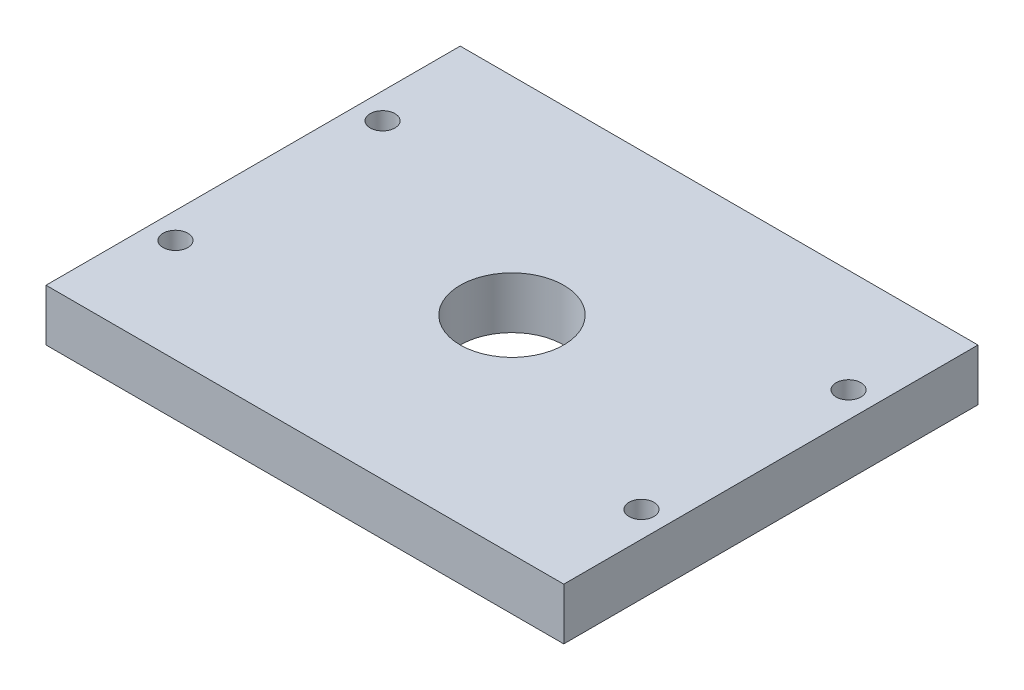
ISO-10303-21;
HEADER;
FILE_DESCRIPTION(('STEP AP214'),'2;1');
FILE_NAME('part.step','',(''),(''),'','','');
FILE_SCHEMA(('AUTOMOTIVE_DESIGN { 1 0 10303 214 1 1 1 1 }'));
ENDSEC;
DATA;
#1=APPLICATION_CONTEXT('core data for automotive mechanical design processes');
#2=APPLICATION_PROTOCOL_DEFINITION('international standard','automotive_design',2000,#1);
#3=PRODUCT_CONTEXT('',#1,'mechanical');
#4=PRODUCT('Part','Part','',(#3));
#5=PRODUCT_RELATED_PRODUCT_CATEGORY('part','',(#4));
#6=PRODUCT_DEFINITION_FORMATION('','',#4);
#7=PRODUCT_DEFINITION_CONTEXT('part definition',#1,'design');
#8=PRODUCT_DEFINITION('design','',#6,#7);
#9=PRODUCT_DEFINITION_SHAPE('','',#8);
#10=(LENGTH_UNIT() NAMED_UNIT(*) SI_UNIT(.MILLI.,.METRE.));
#11=(NAMED_UNIT(*) PLANE_ANGLE_UNIT() SI_UNIT($,.RADIAN.));
#12=(NAMED_UNIT(*) SI_UNIT($,.STERADIAN.) SOLID_ANGLE_UNIT());
#13=UNCERTAINTY_MEASURE_WITH_UNIT(LENGTH_MEASURE(1.E-05),#10,'distance_accuracy_value','');
#14=(GEOMETRIC_REPRESENTATION_CONTEXT(3) GLOBAL_UNCERTAINTY_ASSIGNED_CONTEXT((#13)) GLOBAL_UNIT_ASSIGNED_CONTEXT((#10,
#11,#12)) REPRESENTATION_CONTEXT('',''));
#15=CARTESIAN_POINT('',(0.,0.,0.));
#16=DIRECTION('',(0.,0.,1.));
#17=DIRECTION('',(1.,0.,0.));
#18=AXIS2_PLACEMENT_3D('',#15,#16,#17);
#19=CARTESIAN_POINT('',(0.,5.,0.));
#20=DIRECTION('',(0.,-1.,0.));
#21=DIRECTION('',(0.,0.,-1.));
#22=AXIS2_PLACEMENT_3D('',#19,#20,#21);
#23=PLANE('',#22);
#24=CARTESIAN_POINT('',(-22.5,5.,10.));
#25=DIRECTION('',(0.,-1.,0.));
#26=DIRECTION('',(0.,0.,-1.));
#27=AXIS2_PLACEMENT_3D('',#24,#25,#26);
#28=CIRCLE('',#27,1.2);
#29=CARTESIAN_POINT('',(-22.5,5.,8.8));
#30=VERTEX_POINT('',#29);
#31=EDGE_CURVE('E149',#30,#30,#28,.T.);
#32=ORIENTED_EDGE('',*,*,#31,.T.);
#33=EDGE_LOOP('',(#32));
#34=FACE_BOUND('',#33,.T.);
#35=CARTESIAN_POINT('',(-22.5,5.,-9.99999999999999));
#36=DIRECTION('',(0.,-1.,0.));
#37=DIRECTION('',(0.,0.,-1.));
#38=AXIS2_PLACEMENT_3D('',#35,#36,#37);
#39=CIRCLE('',#38,1.2);
#40=CARTESIAN_POINT('',(-22.5,5.,-11.2));
#41=VERTEX_POINT('',#40);
#42=EDGE_CURVE('E140',#41,#41,#39,.T.);
#43=ORIENTED_EDGE('',*,*,#42,.T.);
#44=EDGE_LOOP('',(#43));
#45=FACE_BOUND('',#44,.T.);
#46=CARTESIAN_POINT('',(22.5,5.,-9.99999999999999));
#47=DIRECTION('',(0.,-1.,0.));
#48=DIRECTION('',(0.,0.,-1.));
#49=AXIS2_PLACEMENT_3D('',#46,#47,#48);
#50=CIRCLE('',#49,1.2);
#51=CARTESIAN_POINT('',(22.5,5.,-11.2));
#52=VERTEX_POINT('',#51);
#53=EDGE_CURVE('E131',#52,#52,#50,.T.);
#54=ORIENTED_EDGE('',*,*,#53,.T.);
#55=EDGE_LOOP('',(#54));
#56=FACE_BOUND('',#55,.T.);
#57=CARTESIAN_POINT('',(22.5,5.,10.));
#58=DIRECTION('',(0.,-1.,0.));
#59=DIRECTION('',(0.,0.,-1.));
#60=AXIS2_PLACEMENT_3D('',#57,#58,#59);
#61=CIRCLE('',#60,1.2);
#62=CARTESIAN_POINT('',(22.5,5.,8.8));
#63=VERTEX_POINT('',#62);
#64=EDGE_CURVE('E120',#63,#63,#61,.T.);
#65=ORIENTED_EDGE('',*,*,#64,.T.);
#66=EDGE_LOOP('',(#65));
#67=FACE_BOUND('',#66,.T.);
#68=DIRECTION('',(0.,0.,-1.));
#69=VECTOR('',#68,1.);
#70=CARTESIAN_POINT('',(25.,5.,20.));
#71=LINE('',#70,#69);
#72=CARTESIAN_POINT('',(25.,5.,20.));
#73=VERTEX_POINT('',#72);
#74=CARTESIAN_POINT('',(25.,5.,-20.));
#75=VERTEX_POINT('',#74);
#76=EDGE_CURVE('E90',#73,#75,#71,.T.);
#77=ORIENTED_EDGE('',*,*,#76,.T.);
#78=DIRECTION('',(-1.,0.,0.));
#79=VECTOR('',#78,1.);
#80=CARTESIAN_POINT('',(-25.,5.,-20.));
#81=LINE('',#80,#79);
#82=CARTESIAN_POINT('',(-25.,5.,-20.));
#83=VERTEX_POINT('',#82);
#84=EDGE_CURVE('E85',#75,#83,#81,.T.);
#85=ORIENTED_EDGE('',*,*,#84,.T.);
#86=DIRECTION('',(0.,0.,1.));
#87=VECTOR('',#86,1.);
#88=CARTESIAN_POINT('',(-25.,5.,20.));
#89=LINE('',#88,#87);
#90=CARTESIAN_POINT('',(-25.,5.,20.));
#91=VERTEX_POINT('',#90);
#92=EDGE_CURVE('E88',#83,#91,#89,.T.);
#93=ORIENTED_EDGE('',*,*,#92,.T.);
#94=DIRECTION('',(1.,0.,0.));
#95=VECTOR('',#94,1.);
#96=CARTESIAN_POINT('',(-25.,5.,20.));
#97=LINE('',#96,#95);
#98=EDGE_CURVE('E55',#91,#73,#97,.T.);
#99=ORIENTED_EDGE('',*,*,#98,.T.);
#100=EDGE_LOOP('',(#77,#85,#93,#99));
#101=FACE_BOUND('',#100,.T.);
#102=CARTESIAN_POINT('',(0.,5.,0.));
#103=DIRECTION('',(0.,1.,0.));
#104=DIRECTION('',(0.,0.,1.));
#105=AXIS2_PLACEMENT_3D('',#102,#103,#104);
#106=CIRCLE('',#105,5.);
#107=CARTESIAN_POINT('',(0.,5.,5.00000000000001));
#108=VERTEX_POINT('',#107);
#109=EDGE_CURVE('E105',#108,#108,#106,.T.);
#110=ORIENTED_EDGE('',*,*,#109,.F.);
#111=EDGE_LOOP('',(#110));
#112=FACE_BOUND('',#111,.T.);
#113=ADVANCED_FACE('F38',(#34,#45,#56,#67,#101,#112),#23,.F.);
#114=CARTESIAN_POINT('',(0.,0.,0.));
#115=DIRECTION('',(0.,-1.,0.));
#116=DIRECTION('',(0.,0.,-1.));
#117=AXIS2_PLACEMENT_3D('',#114,#115,#116);
#118=PLANE('',#117);
#119=CARTESIAN_POINT('',(-22.5,0.,10.));
#120=DIRECTION('',(0.,-1.,0.));
#121=DIRECTION('',(0.,0.,-1.));
#122=AXIS2_PLACEMENT_3D('',#119,#120,#121);
#123=CIRCLE('',#122,2.2);
#124=CARTESIAN_POINT('',(-22.5,0.,7.8));
#125=VERTEX_POINT('',#124);
#126=EDGE_CURVE('E155',#125,#125,#123,.T.);
#127=ORIENTED_EDGE('',*,*,#126,.F.);
#128=EDGE_LOOP('',(#127));
#129=FACE_BOUND('',#128,.T.);
#130=CARTESIAN_POINT('',(-22.5,0.,-9.99999999999999));
#131=DIRECTION('',(0.,-1.,0.));
#132=DIRECTION('',(0.,0.,-1.));
#133=AXIS2_PLACEMENT_3D('',#130,#131,#132);
#134=CIRCLE('',#133,2.2);
#135=CARTESIAN_POINT('',(-22.5,0.,-12.2));
#136=VERTEX_POINT('',#135);
#137=EDGE_CURVE('E146',#136,#136,#134,.T.);
#138=ORIENTED_EDGE('',*,*,#137,.F.);
#139=EDGE_LOOP('',(#138));
#140=FACE_BOUND('',#139,.T.);
#141=CARTESIAN_POINT('',(22.5,0.,-9.99999999999999));
#142=DIRECTION('',(0.,-1.,0.));
#143=DIRECTION('',(0.,0.,-1.));
#144=AXIS2_PLACEMENT_3D('',#141,#142,#143);
#145=CIRCLE('',#144,2.2);
#146=CARTESIAN_POINT('',(22.5,0.,-12.2));
#147=VERTEX_POINT('',#146);
#148=EDGE_CURVE('E137',#147,#147,#145,.T.);
#149=ORIENTED_EDGE('',*,*,#148,.F.);
#150=EDGE_LOOP('',(#149));
#151=FACE_BOUND('',#150,.T.);
#152=CARTESIAN_POINT('',(22.5,0.,10.));
#153=DIRECTION('',(0.,-1.,0.));
#154=DIRECTION('',(0.,0.,-1.));
#155=AXIS2_PLACEMENT_3D('',#152,#153,#154);
#156=CIRCLE('',#155,2.2);
#157=CARTESIAN_POINT('',(22.5,0.,7.8));
#158=VERTEX_POINT('',#157);
#159=EDGE_CURVE('E128',#158,#158,#156,.T.);
#160=ORIENTED_EDGE('',*,*,#159,.F.);
#161=EDGE_LOOP('',(#160));
#162=FACE_BOUND('',#161,.T.);
#163=DIRECTION('',(0.,0.,-1.));
#164=VECTOR('',#163,1.);
#165=CARTESIAN_POINT('',(25.,0.,20.));
#166=LINE('',#165,#164);
#167=CARTESIAN_POINT('',(25.,0.,20.));
#168=VERTEX_POINT('',#167);
#169=CARTESIAN_POINT('',(25.,0.,-20.));
#170=VERTEX_POINT('',#169);
#171=EDGE_CURVE('E102',#168,#170,#166,.T.);
#172=ORIENTED_EDGE('',*,*,#171,.F.);
#173=DIRECTION('',(1.,0.,0.));
#174=VECTOR('',#173,1.);
#175=CARTESIAN_POINT('',(-25.,0.,20.));
#176=LINE('',#175,#174);
#177=CARTESIAN_POINT('',(-25.,0.,20.));
#178=VERTEX_POINT('',#177);
#179=EDGE_CURVE('E78',#178,#168,#176,.T.);
#180=ORIENTED_EDGE('',*,*,#179,.F.);
#181=DIRECTION('',(0.,0.,1.));
#182=VECTOR('',#181,1.);
#183=CARTESIAN_POINT('',(-25.,0.,20.));
#184=LINE('',#183,#182);
#185=CARTESIAN_POINT('',(-25.,0.,-20.));
#186=VERTEX_POINT('',#185);
#187=EDGE_CURVE('E72',#186,#178,#184,.T.);
#188=ORIENTED_EDGE('',*,*,#187,.F.);
#189=DIRECTION('',(-1.,0.,0.));
#190=VECTOR('',#189,1.);
#191=CARTESIAN_POINT('',(-25.,0.,-20.));
#192=LINE('',#191,#190);
#193=EDGE_CURVE('E94',#170,#186,#192,.T.);
#194=ORIENTED_EDGE('',*,*,#193,.F.);
#195=EDGE_LOOP('',(#172,#180,#188,#194));
#196=FACE_BOUND('',#195,.T.);
#197=CARTESIAN_POINT('',(0.,0.,0.));
#198=DIRECTION('',(0.,1.,0.));
#199=DIRECTION('',(0.,0.,1.));
#200=AXIS2_PLACEMENT_3D('',#197,#198,#199);
#201=CIRCLE('',#200,5.);
#202=CARTESIAN_POINT('',(0.,0.,5.00000000000001));
#203=VERTEX_POINT('',#202);
#204=EDGE_CURVE('E117',#203,#203,#201,.T.);
#205=ORIENTED_EDGE('',*,*,#204,.T.);
#206=EDGE_LOOP('',(#205));
#207=FACE_BOUND('',#206,.T.);
#208=ADVANCED_FACE('F113',(#129,#140,#151,#162,#196,#207),#118,.T.);
#209=CARTESIAN_POINT('',(25.,5.,20.));
#210=DIRECTION('',(-1.,0.,0.));
#211=DIRECTION('',(0.,0.,1.));
#212=AXIS2_PLACEMENT_3D('',#209,#210,#211);
#213=PLANE('',#212);
#214=ORIENTED_EDGE('',*,*,#171,.T.);
#215=DIRECTION('',(0.,-1.,0.));
#216=VECTOR('',#215,1.);
#217=CARTESIAN_POINT('',(25.,5.,-20.));
#218=LINE('',#217,#216);
#219=EDGE_CURVE('E11',#75,#170,#218,.T.);
#220=ORIENTED_EDGE('',*,*,#219,.F.);
#221=ORIENTED_EDGE('',*,*,#76,.F.);
#222=DIRECTION('',(0.,-1.,0.));
#223=VECTOR('',#222,1.);
#224=CARTESIAN_POINT('',(25.,5.,20.));
#225=LINE('',#224,#223);
#226=EDGE_CURVE('E98',#73,#168,#225,.T.);
#227=ORIENTED_EDGE('',*,*,#226,.T.);
#228=EDGE_LOOP('',(#214,#220,#221,#227));
#229=FACE_BOUND('',#228,.T.);
#230=ADVANCED_FACE('F40',(#229),#213,.F.);
#231=CARTESIAN_POINT('',(-25.,5.,-20.));
#232=DIRECTION('',(0.,0.,1.));
#233=DIRECTION('',(1.,0.,0.));
#234=AXIS2_PLACEMENT_3D('',#231,#232,#233);
#235=PLANE('',#234);
#236=ORIENTED_EDGE('',*,*,#193,.T.);
#237=DIRECTION('',(0.,-1.,0.));
#238=VECTOR('',#237,1.);
#239=CARTESIAN_POINT('',(-25.,5.,-20.));
#240=LINE('',#239,#238);
#241=EDGE_CURVE('E47',#83,#186,#240,.T.);
#242=ORIENTED_EDGE('',*,*,#241,.F.);
#243=ORIENTED_EDGE('',*,*,#84,.F.);
#244=ORIENTED_EDGE('',*,*,#219,.T.);
#245=EDGE_LOOP('',(#236,#242,#243,#244));
#246=FACE_BOUND('',#245,.T.);
#247=ADVANCED_FACE('F93',(#246),#235,.F.);
#248=CARTESIAN_POINT('',(-25.,5.,20.));
#249=DIRECTION('',(1.,0.,0.));
#250=DIRECTION('',(0.,0.,-1.));
#251=AXIS2_PLACEMENT_3D('',#248,#249,#250);
#252=PLANE('',#251);
#253=ORIENTED_EDGE('',*,*,#187,.T.);
#254=DIRECTION('',(0.,-1.,0.));
#255=VECTOR('',#254,1.);
#256=CARTESIAN_POINT('',(-25.,5.,20.));
#257=LINE('',#256,#255);
#258=EDGE_CURVE('E95',#91,#178,#257,.T.);
#259=ORIENTED_EDGE('',*,*,#258,.F.);
#260=ORIENTED_EDGE('',*,*,#92,.F.);
#261=ORIENTED_EDGE('',*,*,#241,.T.);
#262=EDGE_LOOP('',(#253,#259,#260,#261));
#263=FACE_BOUND('',#262,.T.);
#264=ADVANCED_FACE('F96',(#263),#252,.F.);
#265=CARTESIAN_POINT('',(-25.,5.,20.));
#266=DIRECTION('',(0.,0.,-1.));
#267=DIRECTION('',(-1.,0.,0.));
#268=AXIS2_PLACEMENT_3D('',#265,#266,#267);
#269=PLANE('',#268);
#270=ORIENTED_EDGE('',*,*,#179,.T.);
#271=ORIENTED_EDGE('',*,*,#226,.F.);
#272=ORIENTED_EDGE('',*,*,#98,.F.);
#273=ORIENTED_EDGE('',*,*,#258,.T.);
#274=EDGE_LOOP('',(#270,#271,#272,#273));
#275=FACE_BOUND('',#274,.T.);
#276=ADVANCED_FACE('F110',(#275),#269,.F.);
#277=CARTESIAN_POINT('',(0.,5.,0.));
#278=DIRECTION('',(0.,-1.,0.));
#279=DIRECTION('',(0.,0.,-1.));
#280=AXIS2_PLACEMENT_3D('',#277,#278,#279);
#281=CYLINDRICAL_SURFACE('',#280,5.);
#282=ORIENTED_EDGE('',*,*,#109,.T.);
#283=EDGE_LOOP('',(#282));
#284=FACE_BOUND('',#283,.T.);
#285=ORIENTED_EDGE('',*,*,#204,.F.);
#286=EDGE_LOOP('',(#285));
#287=FACE_BOUND('',#286,.T.);
#288=ADVANCED_FACE('F183',(#284,#287),#281,.F.);
#289=CARTESIAN_POINT('',(22.5,0.,10.));
#290=DIRECTION('',(0.,-1.,0.));
#291=DIRECTION('',(0.,0.,-1.));
#292=AXIS2_PLACEMENT_3D('',#289,#290,#291);
#293=CYLINDRICAL_SURFACE('',#292,1.2);
#294=ORIENTED_EDGE('',*,*,#64,.F.);
#295=EDGE_LOOP('',(#294));
#296=FACE_BOUND('',#295,.T.);
#297=CARTESIAN_POINT('',(22.5,1.,10.));
#298=DIRECTION('',(0.,-1.,0.));
#299=DIRECTION('',(0.,0.,-1.));
#300=AXIS2_PLACEMENT_3D('',#297,#298,#299);
#301=CIRCLE('',#300,1.2);
#302=CARTESIAN_POINT('',(22.5,1.,8.8));
#303=VERTEX_POINT('',#302);
#304=EDGE_CURVE('E125',#303,#303,#301,.T.);
#305=ORIENTED_EDGE('',*,*,#304,.T.);
#306=EDGE_LOOP('',(#305));
#307=FACE_BOUND('',#306,.T.);
#308=ADVANCED_FACE('F173',(#296,#307),#293,.F.);
#309=CARTESIAN_POINT('',(22.5,0.,10.));
#310=DIRECTION('',(0.,-1.,0.));
#311=DIRECTION('',(0.,0.,-1.));
#312=AXIS2_PLACEMENT_3D('',#309,#310,#311);
#313=CONICAL_SURFACE('',#312,2.2,0.785398163397447);
#314=ORIENTED_EDGE('',*,*,#304,.F.);
#315=EDGE_LOOP('',(#314));
#316=FACE_BOUND('',#315,.T.);
#317=ORIENTED_EDGE('',*,*,#159,.T.);
#318=EDGE_LOOP('',(#317));
#319=FACE_BOUND('',#318,.T.);
#320=ADVANCED_FACE('F170',(#316,#319),#313,.F.);
#321=CARTESIAN_POINT('',(22.5,0.,-9.99999999999999));
#322=DIRECTION('',(0.,-1.,0.));
#323=DIRECTION('',(0.,0.,-1.));
#324=AXIS2_PLACEMENT_3D('',#321,#322,#323);
#325=CYLINDRICAL_SURFACE('',#324,1.2);
#326=ORIENTED_EDGE('',*,*,#53,.F.);
#327=EDGE_LOOP('',(#326));
#328=FACE_BOUND('',#327,.T.);
#329=CARTESIAN_POINT('',(22.5,1.,-9.99999999999999));
#330=DIRECTION('',(0.,-1.,0.));
#331=DIRECTION('',(0.,0.,-1.));
#332=AXIS2_PLACEMENT_3D('',#329,#330,#331);
#333=CIRCLE('',#332,1.2);
#334=CARTESIAN_POINT('',(22.5,1.,-11.2));
#335=VERTEX_POINT('',#334);
#336=EDGE_CURVE('E134',#335,#335,#333,.T.);
#337=ORIENTED_EDGE('',*,*,#336,.T.);
#338=EDGE_LOOP('',(#337));
#339=FACE_BOUND('',#338,.T.);
#340=ADVANCED_FACE('F172',(#328,#339),#325,.F.);
#341=CARTESIAN_POINT('',(22.5,0.,-9.99999999999999));
#342=DIRECTION('',(0.,-1.,0.));
#343=DIRECTION('',(0.,0.,-1.));
#344=AXIS2_PLACEMENT_3D('',#341,#342,#343);
#345=CONICAL_SURFACE('',#344,2.2,0.785398163397447);
#346=ORIENTED_EDGE('',*,*,#336,.F.);
#347=EDGE_LOOP('',(#346));
#348=FACE_BOUND('',#347,.T.);
#349=ORIENTED_EDGE('',*,*,#148,.T.);
#350=EDGE_LOOP('',(#349));
#351=FACE_BOUND('',#350,.T.);
#352=ADVANCED_FACE('F180',(#348,#351),#345,.F.);
#353=CARTESIAN_POINT('',(-22.5,0.,-9.99999999999999));
#354=DIRECTION('',(0.,-1.,0.));
#355=DIRECTION('',(0.,0.,-1.));
#356=AXIS2_PLACEMENT_3D('',#353,#354,#355);
#357=CYLINDRICAL_SURFACE('',#356,1.2);
#358=ORIENTED_EDGE('',*,*,#42,.F.);
#359=EDGE_LOOP('',(#358));
#360=FACE_BOUND('',#359,.T.);
#361=CARTESIAN_POINT('',(-22.5,1.,-9.99999999999999));
#362=DIRECTION('',(0.,-1.,0.));
#363=DIRECTION('',(0.,0.,-1.));
#364=AXIS2_PLACEMENT_3D('',#361,#362,#363);
#365=CIRCLE('',#364,1.2);
#366=CARTESIAN_POINT('',(-22.5,1.,-11.2));
#367=VERTEX_POINT('',#366);
#368=EDGE_CURVE('E143',#367,#367,#365,.T.);
#369=ORIENTED_EDGE('',*,*,#368,.T.);
#370=EDGE_LOOP('',(#369));
#371=FACE_BOUND('',#370,.T.);
#372=ADVANCED_FACE('F238',(#360,#371),#357,.F.);
#373=CARTESIAN_POINT('',(-22.5,0.,-9.99999999999999));
#374=DIRECTION('',(0.,-1.,0.));
#375=DIRECTION('',(0.,0.,-1.));
#376=AXIS2_PLACEMENT_3D('',#373,#374,#375);
#377=CONICAL_SURFACE('',#376,2.2,0.785398163397447);
#378=ORIENTED_EDGE('',*,*,#368,.F.);
#379=EDGE_LOOP('',(#378));
#380=FACE_BOUND('',#379,.T.);
#381=ORIENTED_EDGE('',*,*,#137,.T.);
#382=EDGE_LOOP('',(#381));
#383=FACE_BOUND('',#382,.T.);
#384=ADVANCED_FACE('F248',(#380,#383),#377,.F.);
#385=CARTESIAN_POINT('',(-22.5,0.,10.));
#386=DIRECTION('',(0.,-1.,0.));
#387=DIRECTION('',(0.,0.,-1.));
#388=AXIS2_PLACEMENT_3D('',#385,#386,#387);
#389=CYLINDRICAL_SURFACE('',#388,1.2);
#390=ORIENTED_EDGE('',*,*,#31,.F.);
#391=EDGE_LOOP('',(#390));
#392=FACE_BOUND('',#391,.T.);
#393=CARTESIAN_POINT('',(-22.5,1.,10.));
#394=DIRECTION('',(0.,-1.,0.));
#395=DIRECTION('',(0.,0.,-1.));
#396=AXIS2_PLACEMENT_3D('',#393,#394,#395);
#397=CIRCLE('',#396,1.2);
#398=CARTESIAN_POINT('',(-22.5,1.,8.8));
#399=VERTEX_POINT('',#398);
#400=EDGE_CURVE('E152',#399,#399,#397,.T.);
#401=ORIENTED_EDGE('',*,*,#400,.T.);
#402=EDGE_LOOP('',(#401));
#403=FACE_BOUND('',#402,.T.);
#404=ADVANCED_FACE('F258',(#392,#403),#389,.F.);
#405=CARTESIAN_POINT('',(-22.5,0.,10.));
#406=DIRECTION('',(0.,-1.,0.));
#407=DIRECTION('',(0.,0.,-1.));
#408=AXIS2_PLACEMENT_3D('',#405,#406,#407);
#409=CONICAL_SURFACE('',#408,2.2,0.785398163397447);
#410=ORIENTED_EDGE('',*,*,#400,.F.);
#411=EDGE_LOOP('',(#410));
#412=FACE_BOUND('',#411,.T.);
#413=ORIENTED_EDGE('',*,*,#126,.T.);
#414=EDGE_LOOP('',(#413));
#415=FACE_BOUND('',#414,.T.);
#416=ADVANCED_FACE('F159',(#412,#415),#409,.F.);
#417=CLOSED_SHELL('',(#113,#208,#230,#247,#264,#276,#288,#308,#320,#340,#352,#372,#384,#404,#416));
#418=MANIFOLD_SOLID_BREP('B2',#417);
#419=ADVANCED_BREP_SHAPE_REPRESENTATION('',(#18,#418),#14);
#420=SHAPE_DEFINITION_REPRESENTATION(#9,#419);
ENDSEC;
END-ISO-10303-21;
